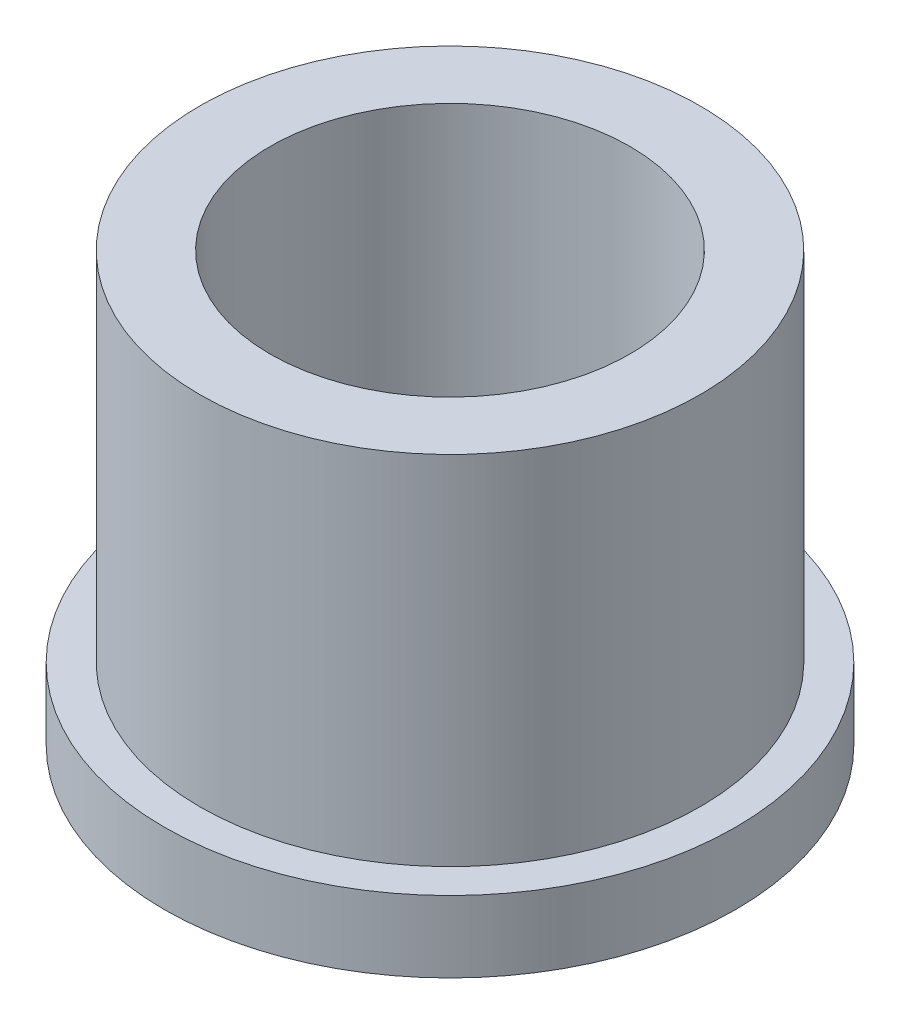
ISO-10303-21;
HEADER;
FILE_DESCRIPTION(('STEP AP214'),'2;1');
FILE_NAME('part.step','',(''),(''),'','','');
FILE_SCHEMA(('AUTOMOTIVE_DESIGN { 1 0 10303 214 1 1 1 1 }'));
ENDSEC;
DATA;
#1=APPLICATION_CONTEXT('core data for automotive mechanical design processes');
#2=APPLICATION_PROTOCOL_DEFINITION('international standard','automotive_design',2000,#1);
#3=PRODUCT_CONTEXT('',#1,'mechanical');
#4=PRODUCT('Part','Part','',(#3));
#5=PRODUCT_RELATED_PRODUCT_CATEGORY('part','',(#4));
#6=PRODUCT_DEFINITION_FORMATION('','',#4);
#7=PRODUCT_DEFINITION_CONTEXT('part definition',#1,'design');
#8=PRODUCT_DEFINITION('design','',#6,#7);
#9=PRODUCT_DEFINITION_SHAPE('','',#8);
#10=(LENGTH_UNIT() NAMED_UNIT(*) SI_UNIT(.MILLI.,.METRE.));
#11=(NAMED_UNIT(*) PLANE_ANGLE_UNIT() SI_UNIT($,.RADIAN.));
#12=(NAMED_UNIT(*) SI_UNIT($,.STERADIAN.) SOLID_ANGLE_UNIT());
#13=UNCERTAINTY_MEASURE_WITH_UNIT(LENGTH_MEASURE(1.E-05),#10,'distance_accuracy_value','');
#14=(GEOMETRIC_REPRESENTATION_CONTEXT(3) GLOBAL_UNCERTAINTY_ASSIGNED_CONTEXT((#13)) GLOBAL_UNIT_ASSIGNED_CONTEXT((#10,
#11,#12)) REPRESENTATION_CONTEXT('',''));
#15=CARTESIAN_POINT('',(0.,0.,0.));
#16=DIRECTION('',(0.,0.,1.));
#17=DIRECTION('',(1.,0.,0.));
#18=AXIS2_PLACEMENT_3D('',#15,#16,#17);
#19=CARTESIAN_POINT('',(0.,9.525,0.));
#20=DIRECTION('',(0.,1.,0.));
#21=DIRECTION('',(0.,0.,1.));
#22=AXIS2_PLACEMENT_3D('',#19,#20,#21);
#23=PLANE('',#22);
#24=CARTESIAN_POINT('',(0.,9.525,0.));
#25=DIRECTION('',(0.,1.,0.));
#26=DIRECTION('',(0.,0.,1.));
#27=AXIS2_PLACEMENT_3D('',#24,#25,#26);
#28=CIRCLE('',#27,11.1252);
#29=CARTESIAN_POINT('',(0.,9.525,11.1252));
#30=VERTEX_POINT('',#29);
#31=EDGE_CURVE('E10',#30,#30,#28,.T.);
#32=ORIENTED_EDGE('',*,*,#31,.T.);
#33=EDGE_LOOP('',(#32));
#34=FACE_BOUND('',#33,.T.);
#35=CARTESIAN_POINT('',(0.,9.525,0.));
#36=DIRECTION('',(0.,1.,0.));
#37=DIRECTION('',(0.,0.,1.));
#38=AXIS2_PLACEMENT_3D('',#35,#36,#37);
#39=CIRCLE('',#38,8.001);
#40=CARTESIAN_POINT('',(0.,9.525,8.001));
#41=VERTEX_POINT('',#40);
#42=EDGE_CURVE('E39',#41,#41,#39,.T.);
#43=ORIENTED_EDGE('',*,*,#42,.F.);
#44=EDGE_LOOP('',(#43));
#45=FACE_BOUND('',#44,.T.);
#46=ADVANCED_FACE('F32',(#34,#45),#23,.T.);
#47=CARTESIAN_POINT('',(0.,9.525,0.));
#48=DIRECTION('',(0.,-1.,0.));
#49=DIRECTION('',(0.,0.,-1.));
#50=AXIS2_PLACEMENT_3D('',#47,#48,#49);
#51=CYLINDRICAL_SURFACE('',#50,11.1252);
#52=CARTESIAN_POINT('',(0.,-6.35,0.));
#53=DIRECTION('',(0.,1.,0.));
#54=DIRECTION('',(0.,0.,1.));
#55=AXIS2_PLACEMENT_3D('',#52,#53,#54);
#56=CIRCLE('',#55,11.1252);
#57=CARTESIAN_POINT('',(0.,-6.35,11.1252));
#58=VERTEX_POINT('',#57);
#59=EDGE_CURVE('E53',#58,#58,#56,.T.);
#60=ORIENTED_EDGE('',*,*,#59,.T.);
#61=EDGE_LOOP('',(#60));
#62=FACE_BOUND('',#61,.T.);
#63=ORIENTED_EDGE('',*,*,#31,.F.);
#64=EDGE_LOOP('',(#63));
#65=FACE_BOUND('',#64,.T.);
#66=ADVANCED_FACE('F34',(#62,#65),#51,.T.);
#67=CARTESIAN_POINT('',(0.,9.525,0.));
#68=DIRECTION('',(0.,-1.,0.));
#69=DIRECTION('',(0.,0.,-1.));
#70=AXIS2_PLACEMENT_3D('',#67,#68,#69);
#71=CYLINDRICAL_SURFACE('',#70,8.001);
#72=ORIENTED_EDGE('',*,*,#42,.T.);
#73=EDGE_LOOP('',(#72));
#74=FACE_BOUND('',#73,.T.);
#75=CARTESIAN_POINT('',(0.,-9.525,0.));
#76=DIRECTION('',(0.,1.,0.));
#77=DIRECTION('',(0.,0.,1.));
#78=AXIS2_PLACEMENT_3D('',#75,#76,#77);
#79=CIRCLE('',#78,8.001);
#80=CARTESIAN_POINT('',(0.,-9.525,8.001));
#81=VERTEX_POINT('',#80);
#82=EDGE_CURVE('E43',#81,#81,#79,.T.);
#83=ORIENTED_EDGE('',*,*,#82,.F.);
#84=EDGE_LOOP('',(#83));
#85=FACE_BOUND('',#84,.T.);
#86=ADVANCED_FACE('F73',(#74,#85),#71,.F.);
#87=CARTESIAN_POINT('',(0.,-9.525,0.));
#88=DIRECTION('',(0.,1.,0.));
#89=DIRECTION('',(0.,0.,1.));
#90=AXIS2_PLACEMENT_3D('',#87,#88,#89);
#91=PLANE('',#90);
#92=ORIENTED_EDGE('',*,*,#82,.T.);
#93=EDGE_LOOP('',(#92));
#94=FACE_BOUND('',#93,.T.);
#95=CARTESIAN_POINT('',(0.,-9.525,0.));
#96=DIRECTION('',(0.,1.,0.));
#97=DIRECTION('',(0.,0.,1.));
#98=AXIS2_PLACEMENT_3D('',#95,#96,#97);
#99=CIRCLE('',#98,12.7);
#100=CARTESIAN_POINT('',(0.,-9.525,12.7));
#101=VERTEX_POINT('',#100);
#102=EDGE_CURVE('E50',#101,#101,#99,.T.);
#103=ORIENTED_EDGE('',*,*,#102,.F.);
#104=EDGE_LOOP('',(#103));
#105=FACE_BOUND('',#104,.T.);
#106=ADVANCED_FACE('F64',(#94,#105),#91,.F.);
#107=CARTESIAN_POINT('',(0.,-6.35,0.));
#108=DIRECTION('',(0.,1.,0.));
#109=DIRECTION('',(0.,0.,1.));
#110=AXIS2_PLACEMENT_3D('',#107,#108,#109);
#111=PLANE('',#110);
#112=CARTESIAN_POINT('',(0.,-6.35,0.));
#113=DIRECTION('',(0.,1.,0.));
#114=DIRECTION('',(0.,0.,1.));
#115=AXIS2_PLACEMENT_3D('',#112,#113,#114);
#116=CIRCLE('',#115,12.7);
#117=CARTESIAN_POINT('',(0.,-6.35,12.7));
#118=VERTEX_POINT('',#117);
#119=EDGE_CURVE('E47',#118,#118,#116,.T.);
#120=ORIENTED_EDGE('',*,*,#119,.T.);
#121=EDGE_LOOP('',(#120));
#122=FACE_BOUND('',#121,.T.);
#123=ORIENTED_EDGE('',*,*,#59,.F.);
#124=EDGE_LOOP('',(#123));
#125=FACE_BOUND('',#124,.T.);
#126=ADVANCED_FACE('F61',(#122,#125),#111,.T.);
#127=CARTESIAN_POINT('',(0.,-6.35,0.));
#128=DIRECTION('',(0.,-1.,0.));
#129=DIRECTION('',(0.,0.,-1.));
#130=AXIS2_PLACEMENT_3D('',#127,#128,#129);
#131=CYLINDRICAL_SURFACE('',#130,12.7);
#132=ORIENTED_EDGE('',*,*,#119,.F.);
#133=EDGE_LOOP('',(#132));
#134=FACE_BOUND('',#133,.T.);
#135=ORIENTED_EDGE('',*,*,#102,.T.);
#136=EDGE_LOOP('',(#135));
#137=FACE_BOUND('',#136,.T.);
#138=ADVANCED_FACE('F63',(#134,#137),#131,.T.);
#139=CLOSED_SHELL('',(#46,#66,#86,#106,#126,#138));
#140=MANIFOLD_SOLID_BREP('B2',#139);
#141=ADVANCED_BREP_SHAPE_REPRESENTATION('',(#18,#140),#14);
#142=SHAPE_DEFINITION_REPRESENTATION(#9,#141);
ENDSEC;
END-ISO-10303-21;
